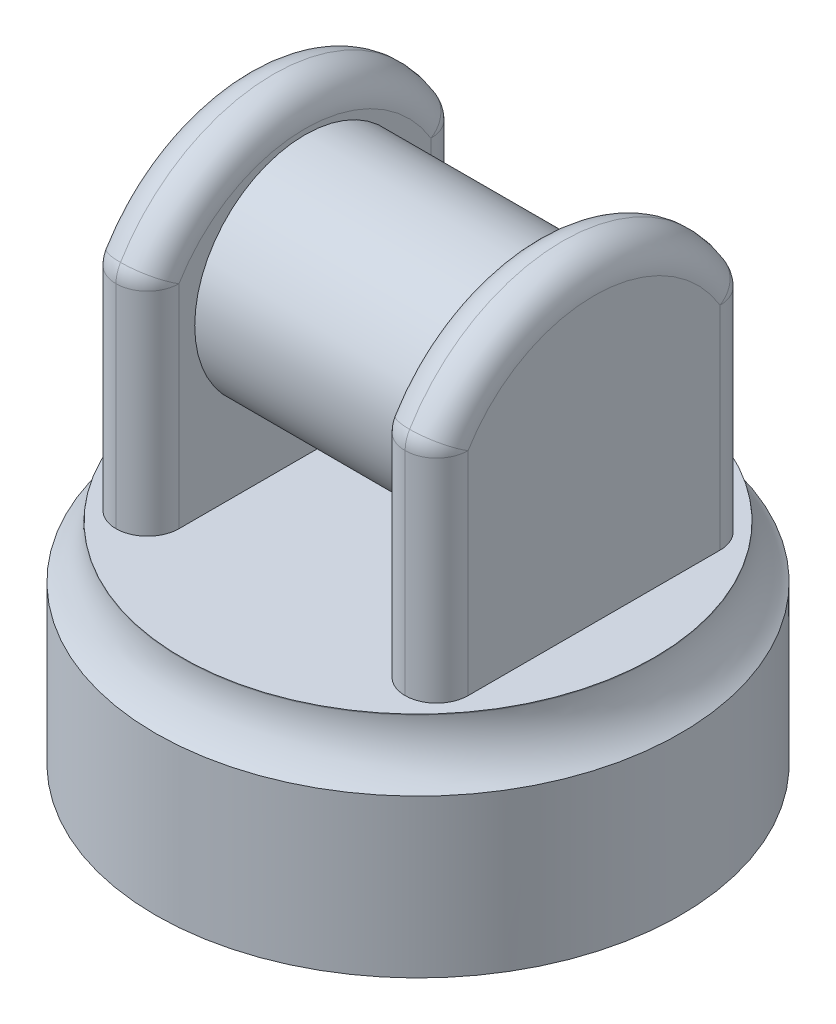
ISO-10303-21;
HEADER;
FILE_DESCRIPTION(('STEP AP214'),'2;1');
FILE_NAME('part.step','',(''),(''),'','','');
FILE_SCHEMA(('AUTOMOTIVE_DESIGN { 1 0 10303 214 1 1 1 1 }'));
ENDSEC;
DATA;
#1=APPLICATION_CONTEXT('core data for automotive mechanical design processes');
#2=APPLICATION_PROTOCOL_DEFINITION('international standard','automotive_design',2000,#1);
#3=PRODUCT_CONTEXT('',#1,'mechanical');
#4=PRODUCT('Part','Part','',(#3));
#5=PRODUCT_RELATED_PRODUCT_CATEGORY('part','',(#4));
#6=PRODUCT_DEFINITION_FORMATION('','',#4);
#7=PRODUCT_DEFINITION_CONTEXT('part definition',#1,'design');
#8=PRODUCT_DEFINITION('design','',#6,#7);
#9=PRODUCT_DEFINITION_SHAPE('','',#8);
#10=(LENGTH_UNIT() NAMED_UNIT(*) SI_UNIT(.MILLI.,.METRE.));
#11=(NAMED_UNIT(*) PLANE_ANGLE_UNIT() SI_UNIT($,.RADIAN.));
#12=(NAMED_UNIT(*) SI_UNIT($,.STERADIAN.) SOLID_ANGLE_UNIT());
#13=UNCERTAINTY_MEASURE_WITH_UNIT(LENGTH_MEASURE(1.E-05),#10,'distance_accuracy_value','');
#14=(GEOMETRIC_REPRESENTATION_CONTEXT(3) GLOBAL_UNCERTAINTY_ASSIGNED_CONTEXT((#13)) GLOBAL_UNIT_ASSIGNED_CONTEXT((#10,
#11,#12)) REPRESENTATION_CONTEXT('',''));
#15=CARTESIAN_POINT('',(0.,0.,0.));
#16=DIRECTION('',(0.,0.,1.));
#17=DIRECTION('',(1.,0.,0.));
#18=AXIS2_PLACEMENT_3D('',#15,#16,#17);
#19=CARTESIAN_POINT('',(10.7705098312484,50.,15.));
#20=DIRECTION('',(1.,0.,0.));
#21=DIRECTION('',(0.,0.,-1.));
#22=AXIS2_PLACEMENT_3D('',#19,#20,#21);
#23=PLANE('',#22);
#24=CARTESIAN_POINT('',(10.7705098312484,36.,0.));
#25=DIRECTION('',(1.,0.,0.));
#26=DIRECTION('',(0.,0.,-1.));
#27=AXIS2_PLACEMENT_3D('',#24,#25,#26);
#28=CIRCLE('',#27,10.5);
#29=CARTESIAN_POINT('',(10.7705098312484,36.,-10.5));
#30=VERTEX_POINT('',#29);
#31=EDGE_CURVE('E11',#30,#30,#28,.F.);
#32=ORIENTED_EDGE('',*,*,#31,.F.);
#33=EDGE_LOOP('',(#32));
#34=FACE_BOUND('',#33,.T.);
#35=CARTESIAN_POINT('',(10.7705098312484,33.,0.));
#36=DIRECTION('',(1.,0.,0.));
#37=DIRECTION('',(0.,0.,-1.));
#38=AXIS2_PLACEMENT_3D('',#35,#36,#37);
#39=CIRCLE('',#38,14.);
#40=CARTESIAN_POINT('',(10.7705098312484,40.211102550928,12.));
#41=VERTEX_POINT('',#40);
#42=CARTESIAN_POINT('',(10.7705098312484,40.211102550928,-12.));
#43=VERTEX_POINT('',#42);
#44=EDGE_CURVE('E237',#41,#43,#39,.F.);
#45=ORIENTED_EDGE('',*,*,#44,.T.);
#46=DIRECTION('',(0.,-1.,0.));
#47=VECTOR('',#46,1.);
#48=CARTESIAN_POINT('',(10.7705098312484,50.,-12.));
#49=LINE('',#48,#47);
#50=CARTESIAN_POINT('',(10.7705098312484,20.,-12.));
#51=VERTEX_POINT('',#50);
#52=EDGE_CURVE('E111',#43,#51,#49,.T.);
#53=ORIENTED_EDGE('',*,*,#52,.T.);
#54=DIRECTION('',(0.,0.,1.));
#55=VECTOR('',#54,1.);
#56=CARTESIAN_POINT('',(10.7705098312484,20.,15.));
#57=LINE('',#56,#55);
#58=CARTESIAN_POINT('',(10.7705098312484,20.,12.));
#59=VERTEX_POINT('',#58);
#60=EDGE_CURVE('E297',#51,#59,#57,.T.);
#61=ORIENTED_EDGE('',*,*,#60,.T.);
#62=DIRECTION('',(0.,-1.,0.));
#63=VECTOR('',#62,1.);
#64=CARTESIAN_POINT('',(10.7705098312484,50.,12.));
#65=LINE('',#64,#63);
#66=EDGE_CURVE('E301',#59,#41,#65,.F.);
#67=ORIENTED_EDGE('',*,*,#66,.T.);
#68=EDGE_LOOP('',(#45,#53,#61,#67));
#69=FACE_BOUND('',#68,.T.);
#70=ADVANCED_FACE('F39',(#34,#69),#23,.F.);
#71=CARTESIAN_POINT('',(16.7705098312484,50.,-15.));
#72=DIRECTION('',(-1.,0.,0.));
#73=DIRECTION('',(0.,0.,1.));
#74=AXIS2_PLACEMENT_3D('',#71,#72,#73);
#75=PLANE('',#74);
#76=DIRECTION('',(0.,0.,-1.));
#77=VECTOR('',#76,1.);
#78=CARTESIAN_POINT('',(16.7705098312484,20.,-15.));
#79=LINE('',#78,#77);
#80=CARTESIAN_POINT('',(16.7705098312484,20.,12.));
#81=VERTEX_POINT('',#80);
#82=CARTESIAN_POINT('',(16.7705098312484,20.,-12.));
#83=VERTEX_POINT('',#82);
#84=EDGE_CURVE('E303',#81,#83,#79,.T.);
#85=ORIENTED_EDGE('',*,*,#84,.T.);
#86=DIRECTION('',(0.,-1.,0.));
#87=VECTOR('',#86,1.);
#88=CARTESIAN_POINT('',(16.7705098312484,50.,-12.));
#89=LINE('',#88,#87);
#90=CARTESIAN_POINT('',(16.7705098312484,40.211102550928,-12.));
#91=VERTEX_POINT('',#90);
#92=EDGE_CURVE('E265',#83,#91,#89,.F.);
#93=ORIENTED_EDGE('',*,*,#92,.T.);
#94=CARTESIAN_POINT('',(16.7705098312484,33.,0.));
#95=DIRECTION('',(-1.,0.,0.));
#96=DIRECTION('',(0.,0.,1.));
#97=AXIS2_PLACEMENT_3D('',#94,#95,#96);
#98=CIRCLE('',#97,14.);
#99=CARTESIAN_POINT('',(16.7705098312484,40.211102550928,12.));
#100=VERTEX_POINT('',#99);
#101=EDGE_CURVE('E261',#91,#100,#98,.F.);
#102=ORIENTED_EDGE('',*,*,#101,.T.);
#103=DIRECTION('',(0.,-1.,0.));
#104=VECTOR('',#103,1.);
#105=CARTESIAN_POINT('',(16.7705098312484,50.,12.));
#106=LINE('',#105,#104);
#107=EDGE_CURVE('E252',#100,#81,#106,.T.);
#108=ORIENTED_EDGE('',*,*,#107,.T.);
#109=EDGE_LOOP('',(#85,#93,#102,#108));
#110=FACE_BOUND('',#109,.T.);
#111=ADVANCED_FACE('F453',(#110),#75,.F.);
#112=CARTESIAN_POINT('',(-10.7705098312484,50.,-15.));
#113=DIRECTION('',(-1.,0.,0.));
#114=DIRECTION('',(0.,0.,1.));
#115=AXIS2_PLACEMENT_3D('',#112,#113,#114);
#116=PLANE('',#115);
#117=CARTESIAN_POINT('',(-10.7705098312484,36.,0.));
#118=DIRECTION('',(-1.,0.,0.));
#119=DIRECTION('',(0.,0.,1.));
#120=AXIS2_PLACEMENT_3D('',#117,#118,#119);
#121=CIRCLE('',#120,10.5);
#122=CARTESIAN_POINT('',(-10.7705098312484,36.,10.5));
#123=VERTEX_POINT('',#122);
#124=EDGE_CURVE('E49',#123,#123,#121,.F.);
#125=ORIENTED_EDGE('',*,*,#124,.F.);
#126=EDGE_LOOP('',(#125));
#127=FACE_BOUND('',#126,.T.);
#128=DIRECTION('',(0.,0.,-1.));
#129=VECTOR('',#128,1.);
#130=CARTESIAN_POINT('',(-10.7705098312484,20.,-15.));
#131=LINE('',#130,#129);
#132=CARTESIAN_POINT('',(-10.7705098312484,20.,12.));
#133=VERTEX_POINT('',#132);
#134=CARTESIAN_POINT('',(-10.7705098312484,20.,-12.));
#135=VERTEX_POINT('',#134);
#136=EDGE_CURVE('E201',#133,#135,#131,.T.);
#137=ORIENTED_EDGE('',*,*,#136,.T.);
#138=DIRECTION('',(0.,-1.,0.));
#139=VECTOR('',#138,1.);
#140=CARTESIAN_POINT('',(-10.7705098312484,50.,-12.));
#141=LINE('',#140,#139);
#142=CARTESIAN_POINT('',(-10.7705098312484,40.211102550928,-12.));
#143=VERTEX_POINT('',#142);
#144=EDGE_CURVE('E307',#135,#143,#141,.F.);
#145=ORIENTED_EDGE('',*,*,#144,.T.);
#146=CARTESIAN_POINT('',(-10.7705098312484,33.,0.));
#147=DIRECTION('',(-1.,0.,0.));
#148=DIRECTION('',(0.,0.,1.));
#149=AXIS2_PLACEMENT_3D('',#146,#147,#148);
#150=CIRCLE('',#149,14.);
#151=CARTESIAN_POINT('',(-10.7705098312484,40.211102550928,12.));
#152=VERTEX_POINT('',#151);
#153=EDGE_CURVE('E312',#143,#152,#150,.F.);
#154=ORIENTED_EDGE('',*,*,#153,.T.);
#155=DIRECTION('',(0.,-1.,0.));
#156=VECTOR('',#155,1.);
#157=CARTESIAN_POINT('',(-10.7705098312484,50.,12.));
#158=LINE('',#157,#156);
#159=EDGE_CURVE('E318',#152,#133,#158,.T.);
#160=ORIENTED_EDGE('',*,*,#159,.T.);
#161=EDGE_LOOP('',(#137,#145,#154,#160));
#162=FACE_BOUND('',#161,.T.);
#163=ADVANCED_FACE('F360',(#127,#162),#116,.F.);
#164=CARTESIAN_POINT('',(-16.7705098312484,50.,15.));
#165=DIRECTION('',(1.,0.,0.));
#166=DIRECTION('',(0.,0.,-1.));
#167=AXIS2_PLACEMENT_3D('',#164,#165,#166);
#168=PLANE('',#167);
#169=CARTESIAN_POINT('',(-16.7705098312484,33.,0.));
#170=DIRECTION('',(1.,0.,0.));
#171=DIRECTION('',(0.,0.,-1.));
#172=AXIS2_PLACEMENT_3D('',#169,#170,#171);
#173=CIRCLE('',#172,14.);
#174=CARTESIAN_POINT('',(-16.7705098312484,40.211102550928,12.));
#175=VERTEX_POINT('',#174);
#176=CARTESIAN_POINT('',(-16.7705098312484,40.211102550928,-12.));
#177=VERTEX_POINT('',#176);
#178=EDGE_CURVE('E325',#175,#177,#173,.F.);
#179=ORIENTED_EDGE('',*,*,#178,.T.);
#180=DIRECTION('',(0.,-1.,0.));
#181=VECTOR('',#180,1.);
#182=CARTESIAN_POINT('',(-16.7705098312484,50.,-12.));
#183=LINE('',#182,#181);
#184=CARTESIAN_POINT('',(-16.7705098312484,20.,-12.));
#185=VERTEX_POINT('',#184);
#186=EDGE_CURVE('E322',#177,#185,#183,.T.);
#187=ORIENTED_EDGE('',*,*,#186,.T.);
#188=DIRECTION('',(0.,0.,1.));
#189=VECTOR('',#188,1.);
#190=CARTESIAN_POINT('',(-16.7705098312484,20.,15.));
#191=LINE('',#190,#189);
#192=CARTESIAN_POINT('',(-16.7705098312484,20.,12.));
#193=VERTEX_POINT('',#192);
#194=EDGE_CURVE('E57',#185,#193,#191,.T.);
#195=ORIENTED_EDGE('',*,*,#194,.T.);
#196=DIRECTION('',(0.,-1.,0.));
#197=VECTOR('',#196,1.);
#198=CARTESIAN_POINT('',(-16.7705098312484,50.,12.));
#199=LINE('',#198,#197);
#200=EDGE_CURVE('E329',#193,#175,#199,.F.);
#201=ORIENTED_EDGE('',*,*,#200,.T.);
#202=EDGE_LOOP('',(#179,#187,#195,#201));
#203=FACE_BOUND('',#202,.T.);
#204=ADVANCED_FACE('F395',(#203),#168,.F.);
#205=CARTESIAN_POINT('',(0.,20.,0.));
#206=DIRECTION('',(0.,1.,0.));
#207=DIRECTION('',(0.,0.,1.));
#208=AXIS2_PLACEMENT_3D('',#205,#206,#207);
#209=PLANE('',#208);
#210=CARTESIAN_POINT('',(0.,20.,0.));
#211=DIRECTION('',(0.,1.,0.));
#212=DIRECTION('',(0.,0.,1.));
#213=AXIS2_PLACEMENT_3D('',#210,#211,#212);
#214=CIRCLE('',#213,22.5);
#215=CARTESIAN_POINT('',(-16.7705098312484,20.,-15.));
#216=VERTEX_POINT('',#215);
#217=CARTESIAN_POINT('',(-16.7705098312484,20.,15.));
#218=VERTEX_POINT('',#217);
#219=EDGE_CURVE('E433',#216,#218,#214,.T.);
#220=ORIENTED_EDGE('',*,*,#219,.T.);
#221=CARTESIAN_POINT('',(16.7705098312484,20.,15.));
#222=VERTEX_POINT('',#221);
#223=EDGE_CURVE('E349',#218,#222,#214,.T.);
#224=ORIENTED_EDGE('',*,*,#223,.T.);
#225=CARTESIAN_POINT('',(16.7705098312484,20.,-15.));
#226=VERTEX_POINT('',#225);
#227=EDGE_CURVE('E341',#222,#226,#214,.T.);
#228=ORIENTED_EDGE('',*,*,#227,.T.);
#229=EDGE_CURVE('E348',#226,#216,#214,.T.);
#230=ORIENTED_EDGE('',*,*,#229,.T.);
#231=EDGE_LOOP('',(#220,#224,#228,#230));
#232=FACE_BOUND('',#231,.T.);
#233=CARTESIAN_POINT('',(-13.7705098312484,20.,12.));
#234=DIRECTION('',(0.,1.,0.));
#235=DIRECTION('',(0.,0.,1.));
#236=AXIS2_PLACEMENT_3D('',#233,#234,#235);
#237=CIRCLE('',#236,3.);
#238=CARTESIAN_POINT('',(-13.7705098312484,20.,15.));
#239=VERTEX_POINT('',#238);
#240=EDGE_CURVE('E137',#239,#193,#237,.F.);
#241=ORIENTED_EDGE('',*,*,#240,.T.);
#242=ORIENTED_EDGE('',*,*,#194,.F.);
#243=CARTESIAN_POINT('',(-13.7705098312484,20.,-12.));
#244=DIRECTION('',(0.,1.,0.));
#245=DIRECTION('',(0.,0.,1.));
#246=AXIS2_PLACEMENT_3D('',#243,#244,#245);
#247=CIRCLE('',#246,3.);
#248=CARTESIAN_POINT('',(-13.7705098312484,20.,-15.));
#249=VERTEX_POINT('',#248);
#250=EDGE_CURVE('E283',#185,#249,#247,.F.);
#251=ORIENTED_EDGE('',*,*,#250,.T.);
#252=CARTESIAN_POINT('',(-13.7705098312484,20.,-12.));
#253=DIRECTION('',(0.,1.,0.));
#254=DIRECTION('',(0.,0.,1.));
#255=AXIS2_PLACEMENT_3D('',#252,#253,#254);
#256=CIRCLE('',#255,3.);
#257=EDGE_CURVE('E279',#249,#135,#256,.F.);
#258=ORIENTED_EDGE('',*,*,#257,.T.);
#259=ORIENTED_EDGE('',*,*,#136,.F.);
#260=CARTESIAN_POINT('',(-13.7705098312484,20.,12.));
#261=DIRECTION('',(0.,1.,0.));
#262=DIRECTION('',(0.,0.,1.));
#263=AXIS2_PLACEMENT_3D('',#260,#261,#262);
#264=CIRCLE('',#263,3.);
#265=EDGE_CURVE('E141',#133,#239,#264,.F.);
#266=ORIENTED_EDGE('',*,*,#265,.T.);
#267=EDGE_LOOP('',(#241,#242,#251,#258,#259,#266));
#268=FACE_BOUND('',#267,.T.);
#269=CARTESIAN_POINT('',(13.7705098312484,20.,12.));
#270=DIRECTION('',(0.,1.,0.));
#271=DIRECTION('',(0.,0.,1.));
#272=AXIS2_PLACEMENT_3D('',#269,#270,#271);
#273=CIRCLE('',#272,3.);
#274=CARTESIAN_POINT('',(13.7705098312484,20.,15.));
#275=VERTEX_POINT('',#274);
#276=EDGE_CURVE('E254',#81,#275,#273,.F.);
#277=ORIENTED_EDGE('',*,*,#276,.T.);
#278=CARTESIAN_POINT('',(13.7705098312484,20.,12.));
#279=DIRECTION('',(0.,1.,0.));
#280=DIRECTION('',(0.,0.,1.));
#281=AXIS2_PLACEMENT_3D('',#278,#279,#280);
#282=CIRCLE('',#281,3.);
#283=EDGE_CURVE('E148',#275,#59,#282,.F.);
#284=ORIENTED_EDGE('',*,*,#283,.T.);
#285=ORIENTED_EDGE('',*,*,#60,.F.);
#286=CARTESIAN_POINT('',(13.7705098312484,20.,-12.));
#287=DIRECTION('',(0.,1.,0.));
#288=DIRECTION('',(0.,0.,1.));
#289=AXIS2_PLACEMENT_3D('',#286,#287,#288);
#290=CIRCLE('',#289,3.);
#291=CARTESIAN_POINT('',(13.7705098312484,20.,-15.));
#292=VERTEX_POINT('',#291);
#293=EDGE_CURVE('E273',#51,#292,#290,.F.);
#294=ORIENTED_EDGE('',*,*,#293,.T.);
#295=CARTESIAN_POINT('',(13.7705098312484,20.,-12.));
#296=DIRECTION('',(0.,1.,0.));
#297=DIRECTION('',(0.,0.,1.));
#298=AXIS2_PLACEMENT_3D('',#295,#296,#297);
#299=CIRCLE('',#298,3.);
#300=EDGE_CURVE('E121',#292,#83,#299,.F.);
#301=ORIENTED_EDGE('',*,*,#300,.T.);
#302=ORIENTED_EDGE('',*,*,#84,.F.);
#303=EDGE_LOOP('',(#277,#284,#285,#294,#301,#302));
#304=FACE_BOUND('',#303,.T.);
#305=ADVANCED_FACE('F295',(#232,#268,#304),#209,.T.);
#306=CARTESIAN_POINT('',(0.,15.,0.));
#307=DIRECTION('',(0.,-1.,0.));
#308=DIRECTION('',(0.,0.,-1.));
#309=AXIS2_PLACEMENT_3D('',#306,#307,#308);
#310=CYLINDRICAL_SURFACE('',#309,25.);
#311=CARTESIAN_POINT('',(0.,15.,0.));
#312=DIRECTION('',(0.,1.,0.));
#313=DIRECTION('',(0.,0.,1.));
#314=AXIS2_PLACEMENT_3D('',#311,#312,#313);
#315=CIRCLE('',#314,25.);
#316=CARTESIAN_POINT('',(0.,15.,25.));
#317=VERTEX_POINT('',#316);
#318=EDGE_CURVE('E336',#317,#317,#315,.T.);
#319=ORIENTED_EDGE('',*,*,#318,.F.);
#320=EDGE_LOOP('',(#319));
#321=FACE_BOUND('',#320,.T.);
#322=CARTESIAN_POINT('',(0.,0.,0.));
#323=DIRECTION('',(0.,1.,0.));
#324=DIRECTION('',(0.,0.,1.));
#325=AXIS2_PLACEMENT_3D('',#322,#323,#324);
#326=CIRCLE('',#325,25.);
#327=CARTESIAN_POINT('',(0.,0.,25.));
#328=VERTEX_POINT('',#327);
#329=EDGE_CURVE('E337',#328,#328,#326,.T.);
#330=ORIENTED_EDGE('',*,*,#329,.T.);
#331=EDGE_LOOP('',(#330));
#332=FACE_BOUND('',#331,.T.);
#333=ADVANCED_FACE('F440',(#321,#332),#310,.T.);
#334=CARTESIAN_POINT('',(0.,0.,0.));
#335=DIRECTION('',(0.,1.,0.));
#336=DIRECTION('',(0.,0.,1.));
#337=AXIS2_PLACEMENT_3D('',#334,#335,#336);
#338=PLANE('',#337);
#339=ORIENTED_EDGE('',*,*,#329,.F.);
#340=EDGE_LOOP('',(#339));
#341=FACE_BOUND('',#340,.T.);
#342=ADVANCED_FACE('F446',(#341),#338,.F.);
#343=CARTESIAN_POINT('',(0.,20.,0.));
#344=DIRECTION('',(0.,-1.,0.));
#345=DIRECTION('',(0.,0.,-1.));
#346=AXIS2_PLACEMENT_3D('',#343,#344,#345);
#347=CYLINDRICAL_SURFACE('',#346,22.5);
#348=CARTESIAN_POINT('',(0.,19.9244289008981,0.));
#349=DIRECTION('',(0.,-1.,0.));
#350=DIRECTION('',(0.,0.,-1.));
#351=AXIS2_PLACEMENT_3D('',#348,#349,#350);
#352=CIRCLE('',#351,22.5);
#353=CARTESIAN_POINT('',(0.,19.9244289008981,-22.5));
#354=VERTEX_POINT('',#353);
#355=EDGE_CURVE('E332',#354,#354,#352,.F.);
#356=ORIENTED_EDGE('',*,*,#355,.T.);
#357=EDGE_LOOP('',(#356));
#358=FACE_BOUND('',#357,.T.);
#359=ORIENTED_EDGE('',*,*,#227,.F.);
#360=ORIENTED_EDGE('',*,*,#223,.F.);
#361=ORIENTED_EDGE('',*,*,#219,.F.);
#362=ORIENTED_EDGE('',*,*,#229,.F.);
#363=EDGE_LOOP('',(#359,#360,#361,#362));
#364=FACE_BOUND('',#363,.T.);
#365=ADVANCED_FACE('F432',(#358,#364),#347,.T.);
#366=CARTESIAN_POINT('',(0.,19.9244289008981,0.));
#367=DIRECTION('',(0.,-1.,0.));
#368=DIRECTION('',(0.,0.,-1.));
#369=AXIS2_PLACEMENT_3D('',#366,#367,#368);
#370=TOROIDAL_SURFACE('',#369,28.6,6.1);
#371=ORIENTED_EDGE('',*,*,#318,.T.);
#372=EDGE_LOOP('',(#371));
#373=FACE_BOUND('',#372,.T.);
#374=ORIENTED_EDGE('',*,*,#355,.F.);
#375=EDGE_LOOP('',(#374));
#376=FACE_BOUND('',#375,.T.);
#377=ADVANCED_FACE('F506',(#373,#376),#370,.F.);
#378=CARTESIAN_POINT('',(-13.7705098312484,50.,-12.));
#379=DIRECTION('',(0.,-1.,0.));
#380=DIRECTION('',(0.,0.,-1.));
#381=AXIS2_PLACEMENT_3D('',#378,#379,#380);
#382=CYLINDRICAL_SURFACE('',#381,3.);
#383=CARTESIAN_POINT('',(-13.7705098312484,40.211102550928,-12.));
#384=DIRECTION('',(0.,1.,0.));
#385=DIRECTION('',(0.,0.,1.));
#386=AXIS2_PLACEMENT_3D('',#383,#384,#385);
#387=CIRCLE('',#386,3.);
#388=CARTESIAN_POINT('',(-13.7705098312484,40.211102550928,-15.));
#389=VERTEX_POINT('',#388);
#390=EDGE_CURVE('E193',#389,#177,#387,.T.);
#391=ORIENTED_EDGE('',*,*,#390,.F.);
#392=DIRECTION('',(0.,-1.,0.));
#393=VECTOR('',#392,1.);
#394=CARTESIAN_POINT('',(-13.7705098312484,50.,-15.));
#395=LINE('',#394,#393);
#396=EDGE_CURVE('E197',#249,#389,#395,.F.);
#397=ORIENTED_EDGE('',*,*,#396,.F.);
#398=ORIENTED_EDGE('',*,*,#250,.F.);
#399=ORIENTED_EDGE('',*,*,#186,.F.);
#400=EDGE_LOOP('',(#391,#397,#398,#399));
#401=FACE_BOUND('',#400,.T.);
#402=ADVANCED_FACE('F409',(#401),#382,.T.);
#403=CARTESIAN_POINT('',(-13.7705098312484,50.,-12.));
#404=DIRECTION('',(0.,-1.,0.));
#405=DIRECTION('',(0.,0.,-1.));
#406=AXIS2_PLACEMENT_3D('',#403,#404,#405);
#407=CYLINDRICAL_SURFACE('',#406,3.);
#408=ORIENTED_EDGE('',*,*,#257,.F.);
#409=ORIENTED_EDGE('',*,*,#396,.T.);
#410=CARTESIAN_POINT('',(-13.7705098312484,40.211102550928,-12.));
#411=DIRECTION('',(0.,1.,0.));
#412=DIRECTION('',(0.,0.,1.));
#413=AXIS2_PLACEMENT_3D('',#410,#411,#412);
#414=CIRCLE('',#413,3.);
#415=EDGE_CURVE('E186',#143,#389,#414,.T.);
#416=ORIENTED_EDGE('',*,*,#415,.F.);
#417=ORIENTED_EDGE('',*,*,#144,.F.);
#418=EDGE_LOOP('',(#408,#409,#416,#417));
#419=FACE_BOUND('',#418,.T.);
#420=ADVANCED_FACE('F370',(#419),#407,.T.);
#421=CARTESIAN_POINT('',(-13.7705098312484,40.211102550928,-12.));
#422=DIRECTION('',(-1.,0.,0.));
#423=DIRECTION('',(0.,0.,1.));
#424=AXIS2_PLACEMENT_3D('',#421,#422,#423);
#425=SPHERICAL_SURFACE('',#424,3.);
#426=CARTESIAN_POINT('',(-13.7705098312484,40.211102550928,-12.));
#427=DIRECTION('',(-1.,0.,0.));
#428=DIRECTION('',(0.,-1.,0.));
#429=AXIS2_PLACEMENT_3D('',#426,#427,#428);
#430=CIRCLE('',#429,3.);
#431=CARTESIAN_POINT('',(-13.7705098312484,41.7563388118411,-14.5714285714286));
#432=VERTEX_POINT('',#431);
#433=EDGE_CURVE('E190',#432,#389,#430,.T.);
#434=ORIENTED_EDGE('',*,*,#433,.T.);
#435=ORIENTED_EDGE('',*,*,#390,.T.);
#436=CARTESIAN_POINT('',(-13.7705098312484,40.211102550928,-12.));
#437=DIRECTION('',(0.,-0.857142857142857,-0.515078753637712));
#438=DIRECTION('',(0.,0.515078753637712,-0.857142857142858));
#439=AXIS2_PLACEMENT_3D('',#436,#437,#438);
#440=CIRCLE('',#439,3.);
#441=EDGE_CURVE('E182',#432,#177,#440,.F.);
#442=ORIENTED_EDGE('',*,*,#441,.F.);
#443=EDGE_LOOP('',(#434,#435,#442));
#444=FACE_BOUND('',#443,.T.);
#445=ADVANCED_FACE('F406',(#444),#425,.T.);
#446=CARTESIAN_POINT('',(-13.7705098312484,40.211102550928,-12.));
#447=DIRECTION('',(1.,0.,0.));
#448=DIRECTION('',(0.,0.,-1.));
#449=AXIS2_PLACEMENT_3D('',#446,#447,#448);
#450=SPHERICAL_SURFACE('',#449,3.);
#451=ORIENTED_EDGE('',*,*,#415,.T.);
#452=ORIENTED_EDGE('',*,*,#433,.F.);
#453=CARTESIAN_POINT('',(-13.7705098312484,40.211102550928,-12.));
#454=DIRECTION('',(0.,-0.857142857142857,-0.515078753637712));
#455=DIRECTION('',(0.,0.515078753637712,-0.857142857142857));
#456=AXIS2_PLACEMENT_3D('',#453,#454,#455);
#457=CIRCLE('',#456,3.);
#458=EDGE_CURVE('E175',#143,#432,#457,.F.);
#459=ORIENTED_EDGE('',*,*,#458,.F.);
#460=EDGE_LOOP('',(#451,#452,#459));
#461=FACE_BOUND('',#460,.T.);
#462=ADVANCED_FACE('F376',(#461),#450,.T.);
#463=CARTESIAN_POINT('',(-13.7705098312484,50.,12.));
#464=DIRECTION('',(0.,-1.,0.));
#465=DIRECTION('',(0.,0.,-1.));
#466=AXIS2_PLACEMENT_3D('',#463,#464,#465);
#467=CYLINDRICAL_SURFACE('',#466,3.);
#468=ORIENTED_EDGE('',*,*,#200,.F.);
#469=ORIENTED_EDGE('',*,*,#240,.F.);
#470=DIRECTION('',(0.,-1.,0.));
#471=VECTOR('',#470,1.);
#472=CARTESIAN_POINT('',(-13.7705098312484,50.,15.));
#473=LINE('',#472,#471);
#474=CARTESIAN_POINT('',(-13.7705098312484,40.211102550928,15.));
#475=VERTEX_POINT('',#474);
#476=EDGE_CURVE('E171',#475,#239,#473,.T.);
#477=ORIENTED_EDGE('',*,*,#476,.F.);
#478=CARTESIAN_POINT('',(-13.7705098312484,40.211102550928,12.));
#479=DIRECTION('',(0.,1.,0.));
#480=DIRECTION('',(0.,0.,1.));
#481=AXIS2_PLACEMENT_3D('',#478,#479,#480);
#482=CIRCLE('',#481,3.);
#483=EDGE_CURVE('E167',#175,#475,#482,.T.);
#484=ORIENTED_EDGE('',*,*,#483,.F.);
#485=EDGE_LOOP('',(#468,#469,#477,#484));
#486=FACE_BOUND('',#485,.T.);
#487=ADVANCED_FACE('F391',(#486),#467,.T.);
#488=CARTESIAN_POINT('',(-13.7705098312484,33.,0.));
#489=DIRECTION('',(1.,0.,0.));
#490=DIRECTION('',(0.,0.,-1.));
#491=AXIS2_PLACEMENT_3D('',#488,#489,#490);
#492=TOROIDAL_SURFACE('',#491,14.,3.);
#493=CARTESIAN_POINT('',(-13.7705098312484,33.,0.));
#494=DIRECTION('',(1.,0.,0.));
#495=DIRECTION('',(0.,0.,-1.));
#496=AXIS2_PLACEMENT_3D('',#493,#494,#495);
#497=CIRCLE('',#496,17.);
#498=CARTESIAN_POINT('',(-13.7705098312484,41.7563388118411,14.5714285714286));
#499=VERTEX_POINT('',#498);
#500=EDGE_CURVE('E179',#432,#499,#497,.T.);
#501=ORIENTED_EDGE('',*,*,#500,.F.);
#502=ORIENTED_EDGE('',*,*,#441,.T.);
#503=ORIENTED_EDGE('',*,*,#178,.F.);
#504=CARTESIAN_POINT('',(-13.7705098312484,40.211102550928,12.));
#505=DIRECTION('',(0.,-0.857142857142857,0.515078753637712));
#506=DIRECTION('',(0.,-0.515078753637712,-0.857142857142858));
#507=AXIS2_PLACEMENT_3D('',#504,#505,#506);
#508=CIRCLE('',#507,3.);
#509=EDGE_CURVE('E163',#499,#175,#508,.T.);
#510=ORIENTED_EDGE('',*,*,#509,.F.);
#511=EDGE_LOOP('',(#501,#502,#503,#510));
#512=FACE_BOUND('',#511,.T.);
#513=ADVANCED_FACE('F401',(#512),#492,.T.);
#514=CARTESIAN_POINT('',(-13.7705098312484,33.,0.));
#515=DIRECTION('',(-1.,0.,0.));
#516=DIRECTION('',(0.,0.,1.));
#517=AXIS2_PLACEMENT_3D('',#514,#515,#516);
#518=TOROIDAL_SURFACE('',#517,14.,3.);
#519=ORIENTED_EDGE('',*,*,#458,.T.);
#520=ORIENTED_EDGE('',*,*,#500,.T.);
#521=CARTESIAN_POINT('',(-13.7705098312484,40.211102550928,12.));
#522=DIRECTION('',(0.,-0.857142857142856,0.515078753637715));
#523=DIRECTION('',(0.,-0.515078753637715,-0.857142857142856));
#524=AXIS2_PLACEMENT_3D('',#521,#522,#523);
#525=CIRCLE('',#524,3.);
#526=EDGE_CURVE('E159',#152,#499,#525,.T.);
#527=ORIENTED_EDGE('',*,*,#526,.F.);
#528=ORIENTED_EDGE('',*,*,#153,.F.);
#529=EDGE_LOOP('',(#519,#520,#527,#528));
#530=FACE_BOUND('',#529,.T.);
#531=ADVANCED_FACE('F380',(#530),#518,.T.);
#532=CARTESIAN_POINT('',(-13.7705098312484,50.,12.));
#533=DIRECTION('',(0.,-1.,0.));
#534=DIRECTION('',(0.,0.,-1.));
#535=AXIS2_PLACEMENT_3D('',#532,#533,#534);
#536=CYLINDRICAL_SURFACE('',#535,3.);
#537=ORIENTED_EDGE('',*,*,#265,.F.);
#538=ORIENTED_EDGE('',*,*,#159,.F.);
#539=CARTESIAN_POINT('',(-13.7705098312484,40.211102550928,12.));
#540=DIRECTION('',(0.,1.,0.));
#541=DIRECTION('',(-1.,0.,0.));
#542=AXIS2_PLACEMENT_3D('',#539,#540,#541);
#543=CIRCLE('',#542,3.);
#544=EDGE_CURVE('E155',#475,#152,#543,.T.);
#545=ORIENTED_EDGE('',*,*,#544,.F.);
#546=ORIENTED_EDGE('',*,*,#476,.T.);
#547=EDGE_LOOP('',(#537,#538,#545,#546));
#548=FACE_BOUND('',#547,.T.);
#549=ADVANCED_FACE('F384',(#548),#536,.T.);
#550=CARTESIAN_POINT('',(-13.7705098312484,40.211102550928,12.));
#551=DIRECTION('',(-1.,0.,0.));
#552=DIRECTION('',(0.,0.,1.));
#553=AXIS2_PLACEMENT_3D('',#550,#551,#552);
#554=SPHERICAL_SURFACE('',#553,3.);
#555=ORIENTED_EDGE('',*,*,#509,.T.);
#556=ORIENTED_EDGE('',*,*,#483,.T.);
#557=CARTESIAN_POINT('',(-13.7705098312484,40.211102550928,12.));
#558=DIRECTION('',(-1.,0.,0.));
#559=DIRECTION('',(0.,0.,1.));
#560=AXIS2_PLACEMENT_3D('',#557,#558,#559);
#561=CIRCLE('',#560,3.);
#562=EDGE_CURVE('E123',#499,#475,#561,.F.);
#563=ORIENTED_EDGE('',*,*,#562,.F.);
#564=EDGE_LOOP('',(#555,#556,#563));
#565=FACE_BOUND('',#564,.T.);
#566=ADVANCED_FACE('F497',(#565),#554,.T.);
#567=CARTESIAN_POINT('',(-13.7705098312484,40.211102550928,12.));
#568=DIRECTION('',(1.,0.,0.));
#569=DIRECTION('',(0.,0.,-1.));
#570=AXIS2_PLACEMENT_3D('',#567,#568,#569);
#571=SPHERICAL_SURFACE('',#570,3.);
#572=ORIENTED_EDGE('',*,*,#544,.T.);
#573=ORIENTED_EDGE('',*,*,#526,.T.);
#574=ORIENTED_EDGE('',*,*,#562,.T.);
#575=EDGE_LOOP('',(#572,#573,#574));
#576=FACE_BOUND('',#575,.T.);
#577=ADVANCED_FACE('F493',(#576),#571,.T.);
#578=CARTESIAN_POINT('',(13.7705098312484,50.,-12.));
#579=DIRECTION('',(0.,-1.,0.));
#580=DIRECTION('',(0.,0.,-1.));
#581=AXIS2_PLACEMENT_3D('',#578,#579,#580);
#582=CYLINDRICAL_SURFACE('',#581,3.);
#583=CARTESIAN_POINT('',(13.7705098312484,40.2111025509279,-12.));
#584=DIRECTION('',(0.,1.,0.));
#585=DIRECTION('',(-1.,0.,0.));
#586=AXIS2_PLACEMENT_3D('',#583,#584,#585);
#587=CIRCLE('',#586,3.);
#588=CARTESIAN_POINT('',(13.7705098312484,40.2111025509279,-15.));
#589=VERTEX_POINT('',#588);
#590=EDGE_CURVE('E95',#589,#43,#587,.T.);
#591=ORIENTED_EDGE('',*,*,#590,.F.);
#592=DIRECTION('',(0.,-1.,0.));
#593=VECTOR('',#592,1.);
#594=CARTESIAN_POINT('',(13.7705098312484,50.,-15.));
#595=LINE('',#594,#593);
#596=EDGE_CURVE('E108',#292,#589,#595,.F.);
#597=ORIENTED_EDGE('',*,*,#596,.F.);
#598=ORIENTED_EDGE('',*,*,#293,.F.);
#599=ORIENTED_EDGE('',*,*,#52,.F.);
#600=EDGE_LOOP('',(#591,#597,#598,#599));
#601=FACE_BOUND('',#600,.T.);
#602=ADVANCED_FACE('F41',(#601),#582,.T.);
#603=CARTESIAN_POINT('',(13.7705098312484,50.,-12.));
#604=DIRECTION('',(0.,-1.,0.));
#605=DIRECTION('',(0.,0.,-1.));
#606=AXIS2_PLACEMENT_3D('',#603,#604,#605);
#607=CYLINDRICAL_SURFACE('',#606,3.);
#608=ORIENTED_EDGE('',*,*,#300,.F.);
#609=ORIENTED_EDGE('',*,*,#596,.T.);
#610=CARTESIAN_POINT('',(13.7705098312484,40.211102550928,-12.));
#611=DIRECTION('',(0.,1.,0.));
#612=DIRECTION('',(0.,0.,1.));
#613=AXIS2_PLACEMENT_3D('',#610,#611,#612);
#614=CIRCLE('',#613,3.);
#615=EDGE_CURVE('E101',#91,#589,#614,.T.);
#616=ORIENTED_EDGE('',*,*,#615,.F.);
#617=ORIENTED_EDGE('',*,*,#92,.F.);
#618=EDGE_LOOP('',(#608,#609,#616,#617));
#619=FACE_BOUND('',#618,.T.);
#620=ADVANCED_FACE('F117',(#619),#607,.T.);
#621=CARTESIAN_POINT('',(13.7705098312484,40.211102550928,-12.));
#622=DIRECTION('',(-1.,0.,0.));
#623=DIRECTION('',(0.,0.,1.));
#624=AXIS2_PLACEMENT_3D('',#621,#622,#623);
#625=SPHERICAL_SURFACE('',#624,3.);
#626=CARTESIAN_POINT('',(13.7705098312484,40.2111025509279,-12.));
#627=DIRECTION('',(-1.,0.,0.));
#628=DIRECTION('',(0.,-1.,0.));
#629=AXIS2_PLACEMENT_3D('',#626,#627,#628);
#630=CIRCLE('',#629,3.);
#631=CARTESIAN_POINT('',(13.7705098312484,41.7563388118411,-14.5714285714286));
#632=VERTEX_POINT('',#631);
#633=EDGE_CURVE('E88',#632,#589,#630,.T.);
#634=ORIENTED_EDGE('',*,*,#633,.T.);
#635=ORIENTED_EDGE('',*,*,#590,.T.);
#636=CARTESIAN_POINT('',(13.7705098312484,40.211102550928,-12.));
#637=DIRECTION('',(0.,-0.857142857142867,-0.515078753637696));
#638=DIRECTION('',(0.,0.515078753637696,-0.857142857142867));
#639=AXIS2_PLACEMENT_3D('',#636,#637,#638);
#640=CIRCLE('',#639,3.);
#641=EDGE_CURVE('E98',#632,#43,#640,.F.);
#642=ORIENTED_EDGE('',*,*,#641,.F.);
#643=EDGE_LOOP('',(#634,#635,#642));
#644=FACE_BOUND('',#643,.T.);
#645=ADVANCED_FACE('F93',(#644),#625,.T.);
#646=CARTESIAN_POINT('',(13.7705098312484,40.211102550928,-12.));
#647=DIRECTION('',(1.,0.,0.));
#648=DIRECTION('',(0.,1.,0.));
#649=AXIS2_PLACEMENT_3D('',#646,#647,#648);
#650=SPHERICAL_SURFACE('',#649,3.);
#651=ORIENTED_EDGE('',*,*,#615,.T.);
#652=ORIENTED_EDGE('',*,*,#633,.F.);
#653=CARTESIAN_POINT('',(13.7705098312484,40.2111025509279,-12.));
#654=DIRECTION('',(0.,-0.857142857142859,-0.51507875363771));
#655=DIRECTION('',(0.,0.51507875363771,-0.857142857142859));
#656=AXIS2_PLACEMENT_3D('',#653,#654,#655);
#657=CIRCLE('',#656,3.);
#658=EDGE_CURVE('E127',#91,#632,#657,.F.);
#659=ORIENTED_EDGE('',*,*,#658,.F.);
#660=EDGE_LOOP('',(#651,#652,#659));
#661=FACE_BOUND('',#660,.T.);
#662=ADVANCED_FACE('F125',(#661),#650,.T.);
#663=CARTESIAN_POINT('',(13.7705098312484,50.,12.));
#664=DIRECTION('',(0.,-1.,0.));
#665=DIRECTION('',(0.,0.,-1.));
#666=AXIS2_PLACEMENT_3D('',#663,#664,#665);
#667=CYLINDRICAL_SURFACE('',#666,3.);
#668=ORIENTED_EDGE('',*,*,#66,.F.);
#669=ORIENTED_EDGE('',*,*,#283,.F.);
#670=DIRECTION('',(0.,-1.,0.));
#671=VECTOR('',#670,1.);
#672=CARTESIAN_POINT('',(13.7705098312484,50.,15.));
#673=LINE('',#672,#671);
#674=CARTESIAN_POINT('',(13.7705098312484,40.211102550928,15.));
#675=VERTEX_POINT('',#674);
#676=EDGE_CURVE('E222',#675,#275,#673,.T.);
#677=ORIENTED_EDGE('',*,*,#676,.F.);
#678=CARTESIAN_POINT('',(13.7705098312484,40.211102550928,12.));
#679=DIRECTION('',(0.,1.,0.));
#680=DIRECTION('',(0.,0.,1.));
#681=AXIS2_PLACEMENT_3D('',#678,#679,#680);
#682=CIRCLE('',#681,3.);
#683=EDGE_CURVE('E218',#41,#675,#682,.T.);
#684=ORIENTED_EDGE('',*,*,#683,.F.);
#685=EDGE_LOOP('',(#668,#669,#677,#684));
#686=FACE_BOUND('',#685,.T.);
#687=ADVANCED_FACE('F305',(#686),#667,.T.);
#688=CARTESIAN_POINT('',(13.7705098312484,33.,0.));
#689=DIRECTION('',(1.,0.,0.));
#690=DIRECTION('',(0.,0.,-1.));
#691=AXIS2_PLACEMENT_3D('',#688,#689,#690);
#692=TOROIDAL_SURFACE('',#691,14.,3.);
#693=CARTESIAN_POINT('',(13.7705098312484,33.,0.));
#694=DIRECTION('',(1.,0.,0.));
#695=DIRECTION('',(0.,0.,-1.));
#696=AXIS2_PLACEMENT_3D('',#693,#694,#695);
#697=CIRCLE('',#696,17.);
#698=CARTESIAN_POINT('',(13.7705098312484,41.7563388118412,14.5714285714285));
#699=VERTEX_POINT('',#698);
#700=EDGE_CURVE('E132',#632,#699,#697,.T.);
#701=ORIENTED_EDGE('',*,*,#700,.F.);
#702=ORIENTED_EDGE('',*,*,#641,.T.);
#703=ORIENTED_EDGE('',*,*,#44,.F.);
#704=CARTESIAN_POINT('',(13.7705098312484,40.211102550928,12.));
#705=DIRECTION('',(0.,-0.857142857142856,0.515078753637715));
#706=DIRECTION('',(0.,-0.515078753637715,-0.857142857142856));
#707=AXIS2_PLACEMENT_3D('',#704,#705,#706);
#708=CIRCLE('',#707,3.);
#709=EDGE_CURVE('E214',#699,#41,#708,.T.);
#710=ORIENTED_EDGE('',*,*,#709,.F.);
#711=EDGE_LOOP('',(#701,#702,#703,#710));
#712=FACE_BOUND('',#711,.T.);
#713=ADVANCED_FACE('F235',(#712),#692,.T.);
#714=CARTESIAN_POINT('',(13.7705098312484,33.,0.));
#715=DIRECTION('',(-1.,0.,0.));
#716=DIRECTION('',(0.,0.,1.));
#717=AXIS2_PLACEMENT_3D('',#714,#715,#716);
#718=TOROIDAL_SURFACE('',#717,14.,3.);
#719=ORIENTED_EDGE('',*,*,#658,.T.);
#720=ORIENTED_EDGE('',*,*,#700,.T.);
#721=CARTESIAN_POINT('',(13.7705098312484,40.211102550928,12.));
#722=DIRECTION('',(0.,-0.857142857142849,0.515078753637726));
#723=DIRECTION('',(0.,-0.515078753637726,-0.857142857142849));
#724=AXIS2_PLACEMENT_3D('',#721,#722,#723);
#725=CIRCLE('',#724,3.);
#726=EDGE_CURVE('E210',#100,#699,#725,.T.);
#727=ORIENTED_EDGE('',*,*,#726,.F.);
#728=ORIENTED_EDGE('',*,*,#101,.F.);
#729=EDGE_LOOP('',(#719,#720,#727,#728));
#730=FACE_BOUND('',#729,.T.);
#731=ADVANCED_FACE('F231',(#730),#718,.T.);
#732=CARTESIAN_POINT('',(13.7705098312484,50.,12.));
#733=DIRECTION('',(0.,-1.,0.));
#734=DIRECTION('',(0.,0.,-1.));
#735=AXIS2_PLACEMENT_3D('',#732,#733,#734);
#736=CYLINDRICAL_SURFACE('',#735,3.);
#737=ORIENTED_EDGE('',*,*,#276,.F.);
#738=ORIENTED_EDGE('',*,*,#107,.F.);
#739=CARTESIAN_POINT('',(13.7705098312484,40.211102550928,12.));
#740=DIRECTION('',(0.,1.,0.));
#741=DIRECTION('',(-1.,0.,0.));
#742=AXIS2_PLACEMENT_3D('',#739,#740,#741);
#743=CIRCLE('',#742,3.);
#744=EDGE_CURVE('E206',#675,#100,#743,.T.);
#745=ORIENTED_EDGE('',*,*,#744,.F.);
#746=ORIENTED_EDGE('',*,*,#676,.T.);
#747=EDGE_LOOP('',(#737,#738,#745,#746));
#748=FACE_BOUND('',#747,.T.);
#749=ADVANCED_FACE('F250',(#748),#736,.T.);
#750=CARTESIAN_POINT('',(13.7705098312484,40.211102550928,12.));
#751=DIRECTION('',(-1.,0.,0.));
#752=DIRECTION('',(0.,0.,1.));
#753=AXIS2_PLACEMENT_3D('',#750,#751,#752);
#754=SPHERICAL_SURFACE('',#753,3.);
#755=ORIENTED_EDGE('',*,*,#709,.T.);
#756=ORIENTED_EDGE('',*,*,#683,.T.);
#757=CARTESIAN_POINT('',(13.7705098312484,40.211102550928,12.));
#758=DIRECTION('',(-1.,0.,0.));
#759=DIRECTION('',(0.,-1.,0.));
#760=AXIS2_PLACEMENT_3D('',#757,#758,#759);
#761=CIRCLE('',#760,3.);
#762=EDGE_CURVE('E202',#699,#675,#761,.F.);
#763=ORIENTED_EDGE('',*,*,#762,.F.);
#764=EDGE_LOOP('',(#755,#756,#763));
#765=FACE_BOUND('',#764,.T.);
#766=ADVANCED_FACE('F244',(#765),#754,.T.);
#767=CARTESIAN_POINT('',(13.7705098312484,40.211102550928,12.));
#768=DIRECTION('',(1.,0.,0.));
#769=DIRECTION('',(0.,1.,0.));
#770=AXIS2_PLACEMENT_3D('',#767,#768,#769);
#771=SPHERICAL_SURFACE('',#770,3.);
#772=ORIENTED_EDGE('',*,*,#744,.T.);
#773=ORIENTED_EDGE('',*,*,#726,.T.);
#774=ORIENTED_EDGE('',*,*,#762,.T.);
#775=EDGE_LOOP('',(#772,#773,#774));
#776=FACE_BOUND('',#775,.T.);
#777=ADVANCED_FACE('F242',(#776),#771,.T.);
#778=CARTESIAN_POINT('',(-25.002,36.,0.));
#779=DIRECTION('',(1.,0.,0.));
#780=DIRECTION('',(0.,0.,-1.));
#781=AXIS2_PLACEMENT_3D('',#778,#779,#780);
#782=CYLINDRICAL_SURFACE('',#781,10.5);
#783=ORIENTED_EDGE('',*,*,#31,.T.);
#784=EDGE_LOOP('',(#783));
#785=FACE_BOUND('',#784,.T.);
#786=ORIENTED_EDGE('',*,*,#124,.T.);
#787=EDGE_LOOP('',(#786));
#788=FACE_BOUND('',#787,.T.);
#789=ADVANCED_FACE('F464',(#785,#788),#782,.T.);
#790=CLOSED_SHELL('',(#70,#111,#163,#204,#305,#333,#342,#365,#377,#402,#420,#445,#462,#487,#513,
#531,#549,#566,#577,#602,#620,#645,#662,#687,#713,#731,#749,#766,#777,#789));
#791=MANIFOLD_SOLID_BREP('B2',#790);
#792=ADVANCED_BREP_SHAPE_REPRESENTATION('',(#18,#791),#14);
#793=SHAPE_DEFINITION_REPRESENTATION(#9,#792);
ENDSEC;
END-ISO-10303-21;
